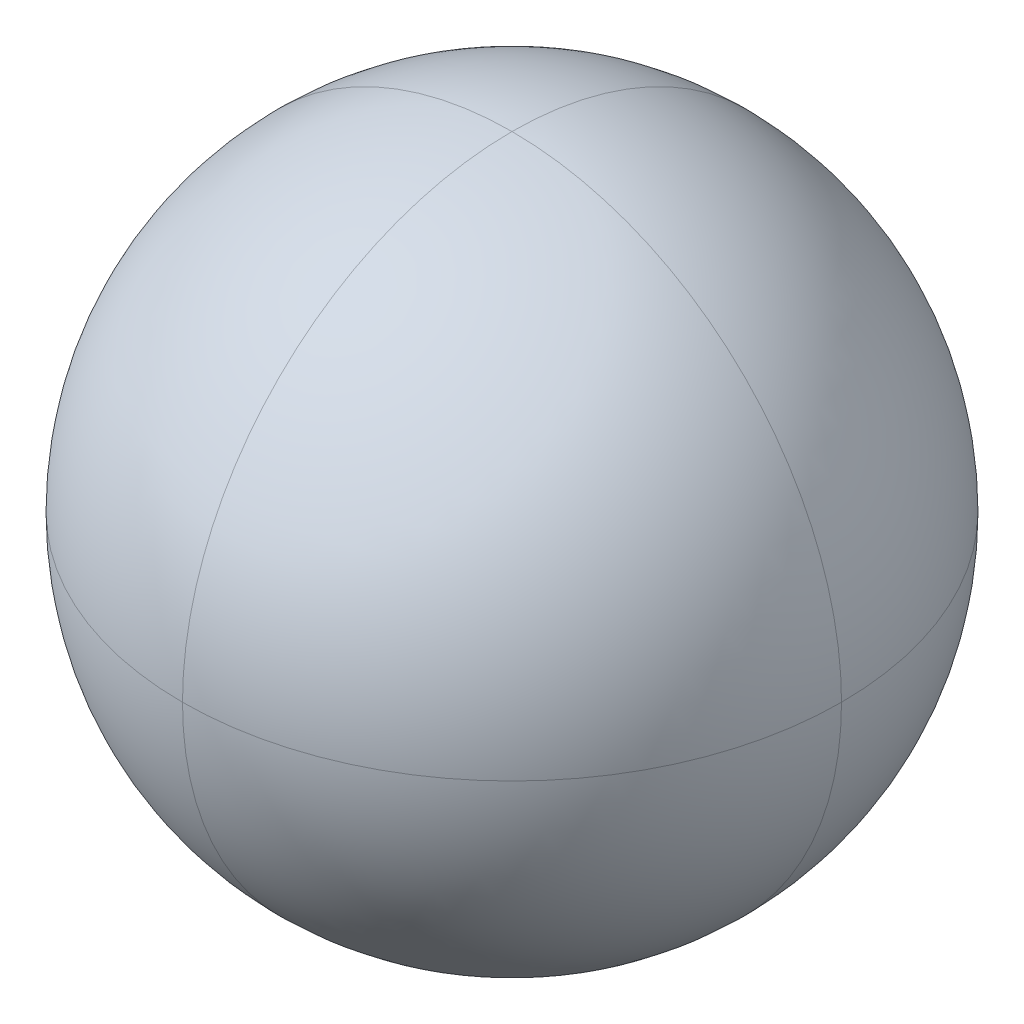
ISO-10303-21;
HEADER;
FILE_DESCRIPTION(('STEP AP214'),'2;1');
FILE_NAME('part.step','',(''),(''),'','','');
FILE_SCHEMA(('AUTOMOTIVE_DESIGN { 1 0 10303 214 1 1 1 1 }'));
ENDSEC;
DATA;
#1=APPLICATION_CONTEXT('core data for automotive mechanical design processes');
#2=APPLICATION_PROTOCOL_DEFINITION('international standard','automotive_design',2000,#1);
#3=PRODUCT_CONTEXT('',#1,'mechanical');
#4=PRODUCT('Part','Part','',(#3));
#5=PRODUCT_RELATED_PRODUCT_CATEGORY('part','',(#4));
#6=PRODUCT_DEFINITION_FORMATION('','',#4);
#7=PRODUCT_DEFINITION_CONTEXT('part definition',#1,'design');
#8=PRODUCT_DEFINITION('design','',#6,#7);
#9=PRODUCT_DEFINITION_SHAPE('','',#8);
#10=(LENGTH_UNIT() NAMED_UNIT(*) SI_UNIT(.MILLI.,.METRE.));
#11=(NAMED_UNIT(*) PLANE_ANGLE_UNIT() SI_UNIT($,.RADIAN.));
#12=(NAMED_UNIT(*) SI_UNIT($,.STERADIAN.) SOLID_ANGLE_UNIT());
#13=UNCERTAINTY_MEASURE_WITH_UNIT(LENGTH_MEASURE(1.E-05),#10,'distance_accuracy_value','');
#14=(GEOMETRIC_REPRESENTATION_CONTEXT(3) GLOBAL_UNCERTAINTY_ASSIGNED_CONTEXT((#13)) GLOBAL_UNIT_ASSIGNED_CONTEXT((#10,
#11,#12)) REPRESENTATION_CONTEXT('',''));
#15=CARTESIAN_POINT('',(0.,0.,0.));
#16=DIRECTION('',(0.,0.,1.));
#17=DIRECTION('',(1.,0.,0.));
#18=AXIS2_PLACEMENT_3D('',#15,#16,#17);
#19=CARTESIAN_POINT('',(0.,0.,0.));
#20=DIRECTION('',(0.,0.,1.));
#21=DIRECTION('',(1.,0.,0.));
#22=AXIS2_PLACEMENT_3D('',#19,#20,#21);
#23=PLANE('',#22);
#24=DIRECTION('',(1.,0.,0.));
#25=VECTOR('',#24,1.);
#26=CARTESIAN_POINT('',(0.,0.,0.));
#27=LINE('',#26,#25);
#28=CARTESIAN_POINT('',(0.,0.,0.));
#29=VERTEX_POINT('',#28);
#30=CARTESIAN_POINT('',(50.,0.,0.));
#31=VERTEX_POINT('',#30);
#32=EDGE_CURVE('E75',#29,#31,#27,.T.);
#33=ORIENTED_EDGE('',*,*,#32,.F.);
#34=DIRECTION('',(0.,-1.,0.));
#35=VECTOR('',#34,1.);
#36=CARTESIAN_POINT('',(0.,0.,0.));
#37=LINE('',#36,#35);
#38=CARTESIAN_POINT('',(0.,-50.,0.));
#39=VERTEX_POINT('',#38);
#40=EDGE_CURVE('E80',#29,#39,#37,.T.);
#41=ORIENTED_EDGE('',*,*,#40,.T.);
#42=CARTESIAN_POINT('',(0.,0.,0.));
#43=DIRECTION('',(0.,0.,1.));
#44=DIRECTION('',(1.,0.,0.));
#45=AXIS2_PLACEMENT_3D('',#42,#43,#44);
#46=CIRCLE('',#45,50.);
#47=EDGE_CURVE('E74',#39,#31,#46,.T.);
#48=ORIENTED_EDGE('',*,*,#47,.T.);
#49=EDGE_LOOP('',(#33,#41,#48));
#50=FACE_BOUND('',#49,.T.);
#51=ADVANCED_FACE('F48',(#50),#23,.T.);
#52=CARTESIAN_POINT('',(0.,0.,0.));
#53=DIRECTION('',(0.,1.,0.));
#54=DIRECTION('',(0.,0.,1.));
#55=AXIS2_PLACEMENT_3D('',#52,#53,#54);
#56=PLANE('',#55);
#57=DIRECTION('',(0.,0.,1.));
#58=VECTOR('',#57,1.);
#59=CARTESIAN_POINT('',(0.,0.,0.));
#60=LINE('',#59,#58);
#61=CARTESIAN_POINT('',(0.,0.,-50.));
#62=VERTEX_POINT('',#61);
#63=EDGE_CURVE('E56',#62,#29,#60,.T.);
#64=ORIENTED_EDGE('',*,*,#63,.T.);
#65=ORIENTED_EDGE('',*,*,#32,.T.);
#66=CARTESIAN_POINT('',(0.,0.,0.));
#67=DIRECTION('',(0.,1.,0.));
#68=DIRECTION('',(0.,0.,1.));
#69=AXIS2_PLACEMENT_3D('',#66,#67,#68);
#70=CIRCLE('',#69,50.);
#71=EDGE_CURVE('E12',#31,#62,#70,.T.);
#72=ORIENTED_EDGE('',*,*,#71,.T.);
#73=EDGE_LOOP('',(#64,#65,#72));
#74=FACE_BOUND('',#73,.T.);
#75=ADVANCED_FACE('F76',(#74),#56,.T.);
#76=CARTESIAN_POINT('',(0.,0.,0.));
#77=DIRECTION('',(1.,0.,0.));
#78=DIRECTION('',(0.,0.,-1.));
#79=AXIS2_PLACEMENT_3D('',#76,#77,#78);
#80=PLANE('',#79);
#81=ORIENTED_EDGE('',*,*,#40,.F.);
#82=ORIENTED_EDGE('',*,*,#63,.F.);
#83=CARTESIAN_POINT('',(0.,0.,0.));
#84=DIRECTION('',(1.,0.,0.));
#85=DIRECTION('',(0.,0.,-1.));
#86=AXIS2_PLACEMENT_3D('',#83,#84,#85);
#87=CIRCLE('',#86,50.);
#88=EDGE_CURVE('E63',#39,#62,#87,.T.);
#89=ORIENTED_EDGE('',*,*,#88,.F.);
#90=EDGE_LOOP('',(#81,#82,#89));
#91=FACE_BOUND('',#90,.T.);
#92=ADVANCED_FACE('F86',(#91),#80,.F.);
#93=CARTESIAN_POINT('',(0.,0.,0.));
#94=DIRECTION('',(0.,1.,0.));
#95=DIRECTION('',(0.,0.,-1.));
#96=AXIS2_PLACEMENT_3D('',#93,#94,#95);
#97=SPHERICAL_SURFACE('',#96,50.);
#98=ORIENTED_EDGE('',*,*,#47,.F.);
#99=ORIENTED_EDGE('',*,*,#88,.T.);
#100=ORIENTED_EDGE('',*,*,#71,.F.);
#101=EDGE_LOOP('',(#98,#99,#100));
#102=FACE_BOUND('',#101,.T.);
#103=ADVANCED_FACE('F50',(#102),#97,.T.);
#104=CLOSED_SHELL('',(#51,#75,#92,#103));
#105=MANIFOLD_SOLID_BREP('B2',#104);
#106=CARTESIAN_POINT('',(0.,0.,0.));
#107=DIRECTION('',(0.,0.,1.));
#108=DIRECTION('',(1.,0.,0.));
#109=AXIS2_PLACEMENT_3D('',#106,#107,#108);
#110=PLANE('',#109);
#111=DIRECTION('',(1.,0.,0.));
#112=VECTOR('',#111,1.);
#113=CARTESIAN_POINT('',(0.,0.,0.));
#114=LINE('',#113,#112);
#115=CARTESIAN_POINT('',(0.,0.,0.));
#116=VERTEX_POINT('',#115);
#117=CARTESIAN_POINT('',(50.,0.,0.));
#118=VERTEX_POINT('',#117);
#119=EDGE_CURVE('E46',#116,#118,#114,.T.);
#120=ORIENTED_EDGE('',*,*,#119,.T.);
#121=CARTESIAN_POINT('',(0.,0.,0.));
#122=DIRECTION('',(0.,0.,1.));
#123=DIRECTION('',(1.,0.,0.));
#124=AXIS2_PLACEMENT_3D('',#121,#122,#123);
#125=CIRCLE('',#124,50.);
#126=CARTESIAN_POINT('',(0.,-50.,0.));
#127=VERTEX_POINT('',#126);
#128=EDGE_CURVE('E164',#127,#118,#125,.T.);
#129=ORIENTED_EDGE('',*,*,#128,.F.);
#130=DIRECTION('',(0.,-1.,0.));
#131=VECTOR('',#130,1.);
#132=CARTESIAN_POINT('',(0.,0.,0.));
#133=LINE('',#132,#131);
#134=EDGE_CURVE('E137',#116,#127,#133,.T.);
#135=ORIENTED_EDGE('',*,*,#134,.F.);
#136=EDGE_LOOP('',(#120,#129,#135));
#137=FACE_BOUND('',#136,.T.);
#138=ADVANCED_FACE('F130',(#137),#110,.F.);
#139=CARTESIAN_POINT('',(0.,0.,0.));
#140=DIRECTION('',(0.,1.,0.));
#141=DIRECTION('',(0.,0.,1.));
#142=AXIS2_PLACEMENT_3D('',#139,#140,#141);
#143=PLANE('',#142);
#144=ORIENTED_EDGE('',*,*,#119,.F.);
#145=DIRECTION('',(0.,0.,1.));
#146=VECTOR('',#145,1.);
#147=CARTESIAN_POINT('',(0.,0.,0.));
#148=LINE('',#147,#146);
#149=CARTESIAN_POINT('',(0.,0.,50.));
#150=VERTEX_POINT('',#149);
#151=EDGE_CURVE('E155',#116,#150,#148,.T.);
#152=ORIENTED_EDGE('',*,*,#151,.T.);
#153=CARTESIAN_POINT('',(0.,0.,0.));
#154=DIRECTION('',(0.,1.,0.));
#155=DIRECTION('',(0.,0.,1.));
#156=AXIS2_PLACEMENT_3D('',#153,#154,#155);
#157=CIRCLE('',#156,50.);
#158=EDGE_CURVE('E158',#150,#118,#157,.T.);
#159=ORIENTED_EDGE('',*,*,#158,.T.);
#160=EDGE_LOOP('',(#144,#152,#159));
#161=FACE_BOUND('',#160,.T.);
#162=ADVANCED_FACE('F156',(#161),#143,.T.);
#163=CARTESIAN_POINT('',(0.,0.,0.));
#164=DIRECTION('',(1.,0.,0.));
#165=DIRECTION('',(0.,0.,-1.));
#166=AXIS2_PLACEMENT_3D('',#163,#164,#165);
#167=PLANE('',#166);
#168=ORIENTED_EDGE('',*,*,#151,.F.);
#169=ORIENTED_EDGE('',*,*,#134,.T.);
#170=CARTESIAN_POINT('',(0.,0.,0.));
#171=DIRECTION('',(1.,0.,0.));
#172=DIRECTION('',(0.,0.,-1.));
#173=AXIS2_PLACEMENT_3D('',#170,#171,#172);
#174=CIRCLE('',#173,50.);
#175=EDGE_CURVE('E159',#150,#127,#174,.T.);
#176=ORIENTED_EDGE('',*,*,#175,.F.);
#177=EDGE_LOOP('',(#168,#169,#176));
#178=FACE_BOUND('',#177,.T.);
#179=ADVANCED_FACE('F162',(#178),#167,.F.);
#180=CARTESIAN_POINT('',(0.,0.,0.));
#181=DIRECTION('',(0.,1.,0.));
#182=DIRECTION('',(0.,0.,-1.));
#183=AXIS2_PLACEMENT_3D('',#180,#181,#182);
#184=SPHERICAL_SURFACE('',#183,50.);
#185=ORIENTED_EDGE('',*,*,#175,.T.);
#186=ORIENTED_EDGE('',*,*,#128,.T.);
#187=ORIENTED_EDGE('',*,*,#158,.F.);
#188=EDGE_LOOP('',(#185,#186,#187));
#189=FACE_BOUND('',#188,.T.);
#190=ADVANCED_FACE('F166',(#189),#184,.T.);
#191=CLOSED_SHELL('',(#138,#162,#179,#190));
#192=MANIFOLD_SOLID_BREP('B6',#191);
#193=CARTESIAN_POINT('',(0.,0.,0.));
#194=DIRECTION('',(0.,0.,1.));
#195=DIRECTION('',(1.,0.,0.));
#196=AXIS2_PLACEMENT_3D('',#193,#194,#195);
#197=PLANE('',#196);
#198=DIRECTION('',(1.,0.,0.));
#199=VECTOR('',#198,1.);
#200=CARTESIAN_POINT('',(0.,0.,0.));
#201=LINE('',#200,#199);
#202=CARTESIAN_POINT('',(-50.,0.,0.));
#203=VERTEX_POINT('',#202);
#204=CARTESIAN_POINT('',(0.,0.,0.));
#205=VERTEX_POINT('',#204);
#206=EDGE_CURVE('E242',#203,#205,#201,.T.);
#207=ORIENTED_EDGE('',*,*,#206,.F.);
#208=CARTESIAN_POINT('',(0.,0.,0.));
#209=DIRECTION('',(0.,0.,1.));
#210=DIRECTION('',(1.,0.,0.));
#211=AXIS2_PLACEMENT_3D('',#208,#209,#210);
#212=CIRCLE('',#211,50.);
#213=CARTESIAN_POINT('',(0.,-50.,0.));
#214=VERTEX_POINT('',#213);
#215=EDGE_CURVE('E245',#203,#214,#212,.T.);
#216=ORIENTED_EDGE('',*,*,#215,.T.);
#217=DIRECTION('',(0.,-1.,0.));
#218=VECTOR('',#217,1.);
#219=CARTESIAN_POINT('',(0.,0.,0.));
#220=LINE('',#219,#218);
#221=EDGE_CURVE('E234',#205,#214,#220,.T.);
#222=ORIENTED_EDGE('',*,*,#221,.F.);
#223=EDGE_LOOP('',(#207,#216,#222));
#224=FACE_BOUND('',#223,.T.);
#225=ADVANCED_FACE('F212',(#224),#197,.T.);
#226=CARTESIAN_POINT('',(0.,0.,0.));
#227=DIRECTION('',(0.,1.,0.));
#228=DIRECTION('',(0.,0.,1.));
#229=AXIS2_PLACEMENT_3D('',#226,#227,#228);
#230=PLANE('',#229);
#231=CARTESIAN_POINT('',(0.,0.,0.));
#232=DIRECTION('',(0.,1.,0.));
#233=DIRECTION('',(0.,0.,1.));
#234=AXIS2_PLACEMENT_3D('',#231,#232,#233);
#235=CIRCLE('',#234,50.);
#236=CARTESIAN_POINT('',(0.,0.,-50.));
#237=VERTEX_POINT('',#236);
#238=EDGE_CURVE('E128',#237,#203,#235,.T.);
#239=ORIENTED_EDGE('',*,*,#238,.T.);
#240=ORIENTED_EDGE('',*,*,#206,.T.);
#241=DIRECTION('',(0.,0.,1.));
#242=VECTOR('',#241,1.);
#243=CARTESIAN_POINT('',(0.,0.,0.));
#244=LINE('',#243,#242);
#245=EDGE_CURVE('E220',#237,#205,#244,.T.);
#246=ORIENTED_EDGE('',*,*,#245,.F.);
#247=EDGE_LOOP('',(#239,#240,#246));
#248=FACE_BOUND('',#247,.T.);
#249=ADVANCED_FACE('F241',(#248),#230,.T.);
#250=CARTESIAN_POINT('',(0.,0.,0.));
#251=DIRECTION('',(1.,0.,0.));
#252=DIRECTION('',(0.,0.,-1.));
#253=AXIS2_PLACEMENT_3D('',#250,#251,#252);
#254=PLANE('',#253);
#255=ORIENTED_EDGE('',*,*,#245,.T.);
#256=ORIENTED_EDGE('',*,*,#221,.T.);
#257=CARTESIAN_POINT('',(0.,0.,0.));
#258=DIRECTION('',(1.,0.,0.));
#259=DIRECTION('',(0.,0.,-1.));
#260=AXIS2_PLACEMENT_3D('',#257,#258,#259);
#261=CIRCLE('',#260,50.);
#262=EDGE_CURVE('E227',#214,#237,#261,.T.);
#263=ORIENTED_EDGE('',*,*,#262,.T.);
#264=EDGE_LOOP('',(#255,#256,#263));
#265=FACE_BOUND('',#264,.T.);
#266=ADVANCED_FACE('F250',(#265),#254,.T.);
#267=CARTESIAN_POINT('',(0.,0.,0.));
#268=DIRECTION('',(0.,1.,0.));
#269=DIRECTION('',(0.,0.,-1.));
#270=AXIS2_PLACEMENT_3D('',#267,#268,#269);
#271=SPHERICAL_SURFACE('',#270,50.);
#272=ORIENTED_EDGE('',*,*,#215,.F.);
#273=ORIENTED_EDGE('',*,*,#238,.F.);
#274=ORIENTED_EDGE('',*,*,#262,.F.);
#275=EDGE_LOOP('',(#272,#273,#274));
#276=FACE_BOUND('',#275,.T.);
#277=ADVANCED_FACE('F214',(#276),#271,.T.);
#278=CLOSED_SHELL('',(#225,#249,#266,#277));
#279=MANIFOLD_SOLID_BREP('B40',#278);
#280=CARTESIAN_POINT('',(0.,0.,0.));
#281=DIRECTION('',(0.,0.,1.));
#282=DIRECTION('',(1.,0.,0.));
#283=AXIS2_PLACEMENT_3D('',#280,#281,#282);
#284=PLANE('',#283);
#285=DIRECTION('',(1.,0.,0.));
#286=VECTOR('',#285,1.);
#287=CARTESIAN_POINT('',(0.,0.,0.));
#288=LINE('',#287,#286);
#289=CARTESIAN_POINT('',(-50.,0.,0.));
#290=VERTEX_POINT('',#289);
#291=CARTESIAN_POINT('',(0.,0.,0.));
#292=VERTEX_POINT('',#291);
#293=EDGE_CURVE('E297',#290,#292,#288,.T.);
#294=ORIENTED_EDGE('',*,*,#293,.T.);
#295=DIRECTION('',(0.,-1.,0.));
#296=VECTOR('',#295,1.);
#297=CARTESIAN_POINT('',(0.,0.,0.));
#298=LINE('',#297,#296);
#299=CARTESIAN_POINT('',(0.,-50.,0.));
#300=VERTEX_POINT('',#299);
#301=EDGE_CURVE('E210',#292,#300,#298,.T.);
#302=ORIENTED_EDGE('',*,*,#301,.T.);
#303=CARTESIAN_POINT('',(0.,0.,0.));
#304=DIRECTION('',(0.,0.,1.));
#305=DIRECTION('',(1.,0.,0.));
#306=AXIS2_PLACEMENT_3D('',#303,#304,#305);
#307=CIRCLE('',#306,50.);
#308=EDGE_CURVE('E314',#290,#300,#307,.T.);
#309=ORIENTED_EDGE('',*,*,#308,.F.);
#310=EDGE_LOOP('',(#294,#302,#309));
#311=FACE_BOUND('',#310,.T.);
#312=ADVANCED_FACE('F294',(#311),#284,.F.);
#313=CARTESIAN_POINT('',(0.,0.,0.));
#314=DIRECTION('',(1.,0.,0.));
#315=DIRECTION('',(0.,0.,-1.));
#316=AXIS2_PLACEMENT_3D('',#313,#314,#315);
#317=PLANE('',#316);
#318=ORIENTED_EDGE('',*,*,#301,.F.);
#319=DIRECTION('',(0.,0.,1.));
#320=VECTOR('',#319,1.);
#321=CARTESIAN_POINT('',(0.,0.,0.));
#322=LINE('',#321,#320);
#323=CARTESIAN_POINT('',(0.,0.,50.));
#324=VERTEX_POINT('',#323);
#325=EDGE_CURVE('E319',#292,#324,#322,.T.);
#326=ORIENTED_EDGE('',*,*,#325,.T.);
#327=CARTESIAN_POINT('',(0.,0.,0.));
#328=DIRECTION('',(1.,0.,0.));
#329=DIRECTION('',(0.,0.,-1.));
#330=AXIS2_PLACEMENT_3D('',#327,#328,#329);
#331=CIRCLE('',#330,50.);
#332=EDGE_CURVE('E322',#324,#300,#331,.T.);
#333=ORIENTED_EDGE('',*,*,#332,.T.);
#334=EDGE_LOOP('',(#318,#326,#333));
#335=FACE_BOUND('',#334,.T.);
#336=ADVANCED_FACE('F321',(#335),#317,.T.);
#337=CARTESIAN_POINT('',(0.,0.,0.));
#338=DIRECTION('',(0.,1.,0.));
#339=DIRECTION('',(0.,0.,1.));
#340=AXIS2_PLACEMENT_3D('',#337,#338,#339);
#341=PLANE('',#340);
#342=ORIENTED_EDGE('',*,*,#293,.F.);
#343=CARTESIAN_POINT('',(0.,0.,0.));
#344=DIRECTION('',(0.,1.,0.));
#345=DIRECTION('',(0.,0.,1.));
#346=AXIS2_PLACEMENT_3D('',#343,#344,#345);
#347=CIRCLE('',#346,50.);
#348=EDGE_CURVE('E325',#290,#324,#347,.T.);
#349=ORIENTED_EDGE('',*,*,#348,.T.);
#350=ORIENTED_EDGE('',*,*,#325,.F.);
#351=EDGE_LOOP('',(#342,#349,#350));
#352=FACE_BOUND('',#351,.T.);
#353=ADVANCED_FACE('F327',(#352),#341,.T.);
#354=CARTESIAN_POINT('',(0.,0.,0.));
#355=DIRECTION('',(0.,1.,0.));
#356=DIRECTION('',(0.,0.,-1.));
#357=AXIS2_PLACEMENT_3D('',#354,#355,#356);
#358=SPHERICAL_SURFACE('',#357,50.);
#359=ORIENTED_EDGE('',*,*,#348,.F.);
#360=ORIENTED_EDGE('',*,*,#308,.T.);
#361=ORIENTED_EDGE('',*,*,#332,.F.);
#362=EDGE_LOOP('',(#359,#360,#361));
#363=FACE_BOUND('',#362,.T.);
#364=ADVANCED_FACE('F329',(#363),#358,.T.);
#365=CLOSED_SHELL('',(#312,#336,#353,#364));
#366=MANIFOLD_SOLID_BREP('B122',#365);
#367=CARTESIAN_POINT('',(0.,0.,0.));
#368=DIRECTION('',(0.,0.,1.));
#369=DIRECTION('',(1.,0.,0.));
#370=AXIS2_PLACEMENT_3D('',#367,#368,#369);
#371=PLANE('',#370);
#372=DIRECTION('',(0.,-1.,0.));
#373=VECTOR('',#372,1.);
#374=CARTESIAN_POINT('',(0.,0.,0.));
#375=LINE('',#374,#373);
#376=CARTESIAN_POINT('',(0.,50.,0.));
#377=VERTEX_POINT('',#376);
#378=CARTESIAN_POINT('',(0.,0.,0.));
#379=VERTEX_POINT('',#378);
#380=EDGE_CURVE('E404',#377,#379,#375,.T.);
#381=ORIENTED_EDGE('',*,*,#380,.T.);
#382=DIRECTION('',(1.,0.,0.));
#383=VECTOR('',#382,1.);
#384=CARTESIAN_POINT('',(0.,0.,0.));
#385=LINE('',#384,#383);
#386=CARTESIAN_POINT('',(50.,0.,0.));
#387=VERTEX_POINT('',#386);
#388=EDGE_CURVE('E408',#379,#387,#385,.T.);
#389=ORIENTED_EDGE('',*,*,#388,.T.);
#390=CARTESIAN_POINT('',(0.,0.,0.));
#391=DIRECTION('',(0.,0.,1.));
#392=DIRECTION('',(1.,0.,0.));
#393=AXIS2_PLACEMENT_3D('',#390,#391,#392);
#394=CIRCLE('',#393,50.);
#395=EDGE_CURVE('E402',#387,#377,#394,.T.);
#396=ORIENTED_EDGE('',*,*,#395,.T.);
#397=EDGE_LOOP('',(#381,#389,#396));
#398=FACE_BOUND('',#397,.T.);
#399=ADVANCED_FACE('F376',(#398),#371,.T.);
#400=CARTESIAN_POINT('',(0.,0.,0.));
#401=DIRECTION('',(0.,1.,0.));
#402=DIRECTION('',(0.,0.,1.));
#403=AXIS2_PLACEMENT_3D('',#400,#401,#402);
#404=PLANE('',#403);
#405=ORIENTED_EDGE('',*,*,#388,.F.);
#406=DIRECTION('',(0.,0.,1.));
#407=VECTOR('',#406,1.);
#408=CARTESIAN_POINT('',(0.,0.,0.));
#409=LINE('',#408,#407);
#410=CARTESIAN_POINT('',(0.,0.,-50.));
#411=VERTEX_POINT('',#410);
#412=EDGE_CURVE('E396',#411,#379,#409,.T.);
#413=ORIENTED_EDGE('',*,*,#412,.F.);
#414=CARTESIAN_POINT('',(0.,0.,0.));
#415=DIRECTION('',(0.,1.,0.));
#416=DIRECTION('',(0.,0.,1.));
#417=AXIS2_PLACEMENT_3D('',#414,#415,#416);
#418=CIRCLE('',#417,50.);
#419=EDGE_CURVE('E384',#387,#411,#418,.T.);
#420=ORIENTED_EDGE('',*,*,#419,.F.);
#421=EDGE_LOOP('',(#405,#413,#420));
#422=FACE_BOUND('',#421,.T.);
#423=ADVANCED_FACE('F414',(#422),#404,.F.);
#424=CARTESIAN_POINT('',(0.,0.,0.));
#425=DIRECTION('',(1.,0.,0.));
#426=DIRECTION('',(0.,0.,-1.));
#427=AXIS2_PLACEMENT_3D('',#424,#425,#426);
#428=PLANE('',#427);
#429=ORIENTED_EDGE('',*,*,#380,.F.);
#430=CARTESIAN_POINT('',(0.,0.,0.));
#431=DIRECTION('',(1.,0.,0.));
#432=DIRECTION('',(0.,0.,-1.));
#433=AXIS2_PLACEMENT_3D('',#430,#431,#432);
#434=CIRCLE('',#433,50.);
#435=EDGE_CURVE('E292',#411,#377,#434,.T.);
#436=ORIENTED_EDGE('',*,*,#435,.F.);
#437=ORIENTED_EDGE('',*,*,#412,.T.);
#438=EDGE_LOOP('',(#429,#436,#437));
#439=FACE_BOUND('',#438,.T.);
#440=ADVANCED_FACE('F405',(#439),#428,.F.);
#441=CARTESIAN_POINT('',(0.,0.,0.));
#442=DIRECTION('',(0.,1.,0.));
#443=DIRECTION('',(0.,0.,-1.));
#444=AXIS2_PLACEMENT_3D('',#441,#442,#443);
#445=SPHERICAL_SURFACE('',#444,50.);
#446=ORIENTED_EDGE('',*,*,#395,.F.);
#447=ORIENTED_EDGE('',*,*,#419,.T.);
#448=ORIENTED_EDGE('',*,*,#435,.T.);
#449=EDGE_LOOP('',(#446,#447,#448));
#450=FACE_BOUND('',#449,.T.);
#451=ADVANCED_FACE('F378',(#450),#445,.T.);
#452=CLOSED_SHELL('',(#399,#423,#440,#451));
#453=MANIFOLD_SOLID_BREP('B204',#452);
#454=CARTESIAN_POINT('',(0.,0.,0.));
#455=DIRECTION('',(0.,0.,1.));
#456=DIRECTION('',(1.,0.,0.));
#457=AXIS2_PLACEMENT_3D('',#454,#455,#456);
#458=PLANE('',#457);
#459=DIRECTION('',(0.,-1.,0.));
#460=VECTOR('',#459,1.);
#461=CARTESIAN_POINT('',(0.,0.,0.));
#462=LINE('',#461,#460);
#463=CARTESIAN_POINT('',(0.,50.,0.));
#464=VERTEX_POINT('',#463);
#465=CARTESIAN_POINT('',(0.,0.,0.));
#466=VERTEX_POINT('',#465);
#467=EDGE_CURVE('E465',#464,#466,#462,.T.);
#468=ORIENTED_EDGE('',*,*,#467,.F.);
#469=CARTESIAN_POINT('',(0.,0.,0.));
#470=DIRECTION('',(0.,0.,1.));
#471=DIRECTION('',(1.,0.,0.));
#472=AXIS2_PLACEMENT_3D('',#469,#470,#471);
#473=CIRCLE('',#472,50.);
#474=CARTESIAN_POINT('',(50.,0.,0.));
#475=VERTEX_POINT('',#474);
#476=EDGE_CURVE('E487',#475,#464,#473,.T.);
#477=ORIENTED_EDGE('',*,*,#476,.F.);
#478=DIRECTION('',(1.,0.,0.));
#479=VECTOR('',#478,1.);
#480=CARTESIAN_POINT('',(0.,0.,0.));
#481=LINE('',#480,#479);
#482=EDGE_CURVE('E374',#466,#475,#481,.T.);
#483=ORIENTED_EDGE('',*,*,#482,.F.);
#484=EDGE_LOOP('',(#468,#477,#483));
#485=FACE_BOUND('',#484,.T.);
#486=ADVANCED_FACE('F458',(#485),#458,.F.);
#487=CARTESIAN_POINT('',(0.,0.,0.));
#488=DIRECTION('',(1.,0.,0.));
#489=DIRECTION('',(0.,0.,-1.));
#490=AXIS2_PLACEMENT_3D('',#487,#488,#489);
#491=PLANE('',#490);
#492=CARTESIAN_POINT('',(0.,0.,0.));
#493=DIRECTION('',(1.,0.,0.));
#494=DIRECTION('',(0.,0.,-1.));
#495=AXIS2_PLACEMENT_3D('',#492,#493,#494);
#496=CIRCLE('',#495,50.);
#497=CARTESIAN_POINT('',(0.,0.,50.));
#498=VERTEX_POINT('',#497);
#499=EDGE_CURVE('E486',#464,#498,#496,.T.);
#500=ORIENTED_EDGE('',*,*,#499,.F.);
#501=ORIENTED_EDGE('',*,*,#467,.T.);
#502=DIRECTION('',(0.,0.,1.));
#503=VECTOR('',#502,1.);
#504=CARTESIAN_POINT('',(0.,0.,0.));
#505=LINE('',#504,#503);
#506=EDGE_CURVE('E483',#466,#498,#505,.T.);
#507=ORIENTED_EDGE('',*,*,#506,.T.);
#508=EDGE_LOOP('',(#500,#501,#507));
#509=FACE_BOUND('',#508,.T.);
#510=ADVANCED_FACE('F485',(#509),#491,.F.);
#511=CARTESIAN_POINT('',(0.,0.,0.));
#512=DIRECTION('',(0.,1.,0.));
#513=DIRECTION('',(0.,0.,1.));
#514=AXIS2_PLACEMENT_3D('',#511,#512,#513);
#515=PLANE('',#514);
#516=ORIENTED_EDGE('',*,*,#506,.F.);
#517=ORIENTED_EDGE('',*,*,#482,.T.);
#518=CARTESIAN_POINT('',(0.,0.,0.));
#519=DIRECTION('',(0.,1.,0.));
#520=DIRECTION('',(0.,0.,1.));
#521=AXIS2_PLACEMENT_3D('',#518,#519,#520);
#522=CIRCLE('',#521,50.);
#523=EDGE_CURVE('E488',#498,#475,#522,.T.);
#524=ORIENTED_EDGE('',*,*,#523,.F.);
#525=EDGE_LOOP('',(#516,#517,#524));
#526=FACE_BOUND('',#525,.T.);
#527=ADVANCED_FACE('F494',(#526),#515,.F.);
#528=CARTESIAN_POINT('',(0.,0.,0.));
#529=DIRECTION('',(0.,1.,0.));
#530=DIRECTION('',(0.,0.,-1.));
#531=AXIS2_PLACEMENT_3D('',#528,#529,#530);
#532=SPHERICAL_SURFACE('',#531,50.);
#533=ORIENTED_EDGE('',*,*,#523,.T.);
#534=ORIENTED_EDGE('',*,*,#476,.T.);
#535=ORIENTED_EDGE('',*,*,#499,.T.);
#536=EDGE_LOOP('',(#533,#534,#535));
#537=FACE_BOUND('',#536,.T.);
#538=ADVANCED_FACE('F492',(#537),#532,.T.);
#539=CLOSED_SHELL('',(#486,#510,#527,#538));
#540=MANIFOLD_SOLID_BREP('B286',#539);
#541=CARTESIAN_POINT('',(0.,0.,0.));
#542=DIRECTION('',(0.,0.,1.));
#543=DIRECTION('',(1.,0.,0.));
#544=AXIS2_PLACEMENT_3D('',#541,#542,#543);
#545=PLANE('',#544);
#546=CARTESIAN_POINT('',(0.,0.,0.));
#547=DIRECTION('',(0.,0.,1.));
#548=DIRECTION('',(1.,0.,0.));
#549=AXIS2_PLACEMENT_3D('',#546,#547,#548);
#550=CIRCLE('',#549,50.);
#551=CARTESIAN_POINT('',(0.,50.,0.));
#552=VERTEX_POINT('',#551);
#553=CARTESIAN_POINT('',(-50.,0.,0.));
#554=VERTEX_POINT('',#553);
#555=EDGE_CURVE('E571',#552,#554,#550,.T.);
#556=ORIENTED_EDGE('',*,*,#555,.T.);
#557=DIRECTION('',(1.,0.,0.));
#558=VECTOR('',#557,1.);
#559=CARTESIAN_POINT('',(0.,0.,0.));
#560=LINE('',#559,#558);
#561=CARTESIAN_POINT('',(0.,0.,0.));
#562=VERTEX_POINT('',#561);
#563=EDGE_CURVE('E572',#554,#562,#560,.T.);
#564=ORIENTED_EDGE('',*,*,#563,.T.);
#565=DIRECTION('',(0.,-1.,0.));
#566=VECTOR('',#565,1.);
#567=CARTESIAN_POINT('',(0.,0.,0.));
#568=LINE('',#567,#566);
#569=EDGE_CURVE('E559',#552,#562,#568,.T.);
#570=ORIENTED_EDGE('',*,*,#569,.F.);
#571=EDGE_LOOP('',(#556,#564,#570));
#572=FACE_BOUND('',#571,.T.);
#573=ADVANCED_FACE('F539',(#572),#545,.T.);
#574=CARTESIAN_POINT('',(0.,0.,0.));
#575=DIRECTION('',(0.,1.,0.));
#576=DIRECTION('',(0.,0.,1.));
#577=AXIS2_PLACEMENT_3D('',#574,#575,#576);
#578=PLANE('',#577);
#579=ORIENTED_EDGE('',*,*,#563,.F.);
#580=CARTESIAN_POINT('',(0.,0.,0.));
#581=DIRECTION('',(0.,1.,0.));
#582=DIRECTION('',(0.,0.,1.));
#583=AXIS2_PLACEMENT_3D('',#580,#581,#582);
#584=CIRCLE('',#583,50.);
#585=CARTESIAN_POINT('',(0.,0.,-50.));
#586=VERTEX_POINT('',#585);
#587=EDGE_CURVE('E547',#586,#554,#584,.T.);
#588=ORIENTED_EDGE('',*,*,#587,.F.);
#589=DIRECTION('',(0.,0.,1.));
#590=VECTOR('',#589,1.);
#591=CARTESIAN_POINT('',(0.,0.,0.));
#592=LINE('',#591,#590);
#593=EDGE_CURVE('E566',#586,#562,#592,.T.);
#594=ORIENTED_EDGE('',*,*,#593,.T.);
#595=EDGE_LOOP('',(#579,#588,#594));
#596=FACE_BOUND('',#595,.T.);
#597=ADVANCED_FACE('F577',(#596),#578,.F.);
#598=CARTESIAN_POINT('',(0.,0.,0.));
#599=DIRECTION('',(1.,0.,0.));
#600=DIRECTION('',(0.,0.,-1.));
#601=AXIS2_PLACEMENT_3D('',#598,#599,#600);
#602=PLANE('',#601);
#603=CARTESIAN_POINT('',(0.,0.,0.));
#604=DIRECTION('',(1.,0.,0.));
#605=DIRECTION('',(0.,0.,-1.));
#606=AXIS2_PLACEMENT_3D('',#603,#604,#605);
#607=CIRCLE('',#606,50.);
#608=EDGE_CURVE('E456',#586,#552,#607,.T.);
#609=ORIENTED_EDGE('',*,*,#608,.T.);
#610=ORIENTED_EDGE('',*,*,#569,.T.);
#611=ORIENTED_EDGE('',*,*,#593,.F.);
#612=EDGE_LOOP('',(#609,#610,#611));
#613=FACE_BOUND('',#612,.T.);
#614=ADVANCED_FACE('F565',(#613),#602,.T.);
#615=CARTESIAN_POINT('',(0.,0.,0.));
#616=DIRECTION('',(0.,1.,0.));
#617=DIRECTION('',(0.,0.,-1.));
#618=AXIS2_PLACEMENT_3D('',#615,#616,#617);
#619=SPHERICAL_SURFACE('',#618,50.);
#620=ORIENTED_EDGE('',*,*,#555,.F.);
#621=ORIENTED_EDGE('',*,*,#608,.F.);
#622=ORIENTED_EDGE('',*,*,#587,.T.);
#623=EDGE_LOOP('',(#620,#621,#622));
#624=FACE_BOUND('',#623,.T.);
#625=ADVANCED_FACE('F541',(#624),#619,.T.);
#626=CLOSED_SHELL('',(#573,#597,#614,#625));
#627=MANIFOLD_SOLID_BREP('B368',#626);
#628=CARTESIAN_POINT('',(0.,0.,0.));
#629=DIRECTION('',(0.,0.,1.));
#630=DIRECTION('',(1.,0.,0.));
#631=AXIS2_PLACEMENT_3D('',#628,#629,#630);
#632=PLANE('',#631);
#633=CARTESIAN_POINT('',(0.,0.,0.));
#634=DIRECTION('',(0.,0.,1.));
#635=DIRECTION('',(1.,0.,0.));
#636=AXIS2_PLACEMENT_3D('',#633,#634,#635);
#637=CIRCLE('',#636,50.);
#638=CARTESIAN_POINT('',(0.,50.,0.));
#639=VERTEX_POINT('',#638);
#640=CARTESIAN_POINT('',(-50.,0.,0.));
#641=VERTEX_POINT('',#640);
#642=EDGE_CURVE('E640',#639,#641,#637,.T.);
#643=ORIENTED_EDGE('',*,*,#642,.F.);
#644=DIRECTION('',(0.,-1.,0.));
#645=VECTOR('',#644,1.);
#646=CARTESIAN_POINT('',(0.,0.,0.));
#647=LINE('',#646,#645);
#648=CARTESIAN_POINT('',(0.,0.,0.));
#649=VERTEX_POINT('',#648);
#650=EDGE_CURVE('E537',#639,#649,#647,.T.);
#651=ORIENTED_EDGE('',*,*,#650,.T.);
#652=DIRECTION('',(1.,0.,0.));
#653=VECTOR('',#652,1.);
#654=CARTESIAN_POINT('',(0.,0.,0.));
#655=LINE('',#654,#653);
#656=EDGE_CURVE('E614',#641,#649,#655,.T.);
#657=ORIENTED_EDGE('',*,*,#656,.F.);
#658=EDGE_LOOP('',(#643,#651,#657));
#659=FACE_BOUND('',#658,.T.);
#660=ADVANCED_FACE('F611',(#659),#632,.F.);
#661=CARTESIAN_POINT('',(0.,0.,0.));
#662=DIRECTION('',(0.,1.,0.));
#663=DIRECTION('',(0.,0.,1.));
#664=AXIS2_PLACEMENT_3D('',#661,#662,#663);
#665=PLANE('',#664);
#666=CARTESIAN_POINT('',(0.,0.,0.));
#667=DIRECTION('',(0.,1.,0.));
#668=DIRECTION('',(0.,0.,1.));
#669=AXIS2_PLACEMENT_3D('',#666,#667,#668);
#670=CIRCLE('',#669,50.);
#671=CARTESIAN_POINT('',(0.,0.,50.));
#672=VERTEX_POINT('',#671);
#673=EDGE_CURVE('E637',#641,#672,#670,.T.);
#674=ORIENTED_EDGE('',*,*,#673,.F.);
#675=ORIENTED_EDGE('',*,*,#656,.T.);
#676=DIRECTION('',(0.,0.,1.));
#677=VECTOR('',#676,1.);
#678=CARTESIAN_POINT('',(0.,0.,0.));
#679=LINE('',#678,#677);
#680=EDGE_CURVE('E634',#649,#672,#679,.T.);
#681=ORIENTED_EDGE('',*,*,#680,.T.);
#682=EDGE_LOOP('',(#674,#675,#681));
#683=FACE_BOUND('',#682,.T.);
#684=ADVANCED_FACE('F636',(#683),#665,.F.);
#685=CARTESIAN_POINT('',(0.,0.,0.));
#686=DIRECTION('',(1.,0.,0.));
#687=DIRECTION('',(0.,0.,-1.));
#688=AXIS2_PLACEMENT_3D('',#685,#686,#687);
#689=PLANE('',#688);
#690=ORIENTED_EDGE('',*,*,#650,.F.);
#691=CARTESIAN_POINT('',(0.,0.,0.));
#692=DIRECTION('',(1.,0.,0.));
#693=DIRECTION('',(0.,0.,-1.));
#694=AXIS2_PLACEMENT_3D('',#691,#692,#693);
#695=CIRCLE('',#694,50.);
#696=EDGE_CURVE('E645',#639,#672,#695,.T.);
#697=ORIENTED_EDGE('',*,*,#696,.T.);
#698=ORIENTED_EDGE('',*,*,#680,.F.);
#699=EDGE_LOOP('',(#690,#697,#698));
#700=FACE_BOUND('',#699,.T.);
#701=ADVANCED_FACE('F647',(#700),#689,.T.);
#702=CARTESIAN_POINT('',(0.,0.,0.));
#703=DIRECTION('',(0.,1.,0.));
#704=DIRECTION('',(0.,0.,-1.));
#705=AXIS2_PLACEMENT_3D('',#702,#703,#704);
#706=SPHERICAL_SURFACE('',#705,50.);
#707=ORIENTED_EDGE('',*,*,#696,.F.);
#708=ORIENTED_EDGE('',*,*,#642,.T.);
#709=ORIENTED_EDGE('',*,*,#673,.T.);
#710=EDGE_LOOP('',(#707,#708,#709));
#711=FACE_BOUND('',#710,.T.);
#712=ADVANCED_FACE('F644',(#711),#706,.T.);
#713=CLOSED_SHELL('',(#660,#684,#701,#712));
#714=MANIFOLD_SOLID_BREP('B450',#713);
#715=ADVANCED_BREP_SHAPE_REPRESENTATION('',(#18,#105,#192,#279,#366,#453,#540,#627,#714),#14);
#716=SHAPE_DEFINITION_REPRESENTATION(#9,#715);
ENDSEC;
END-ISO-10303-21;
